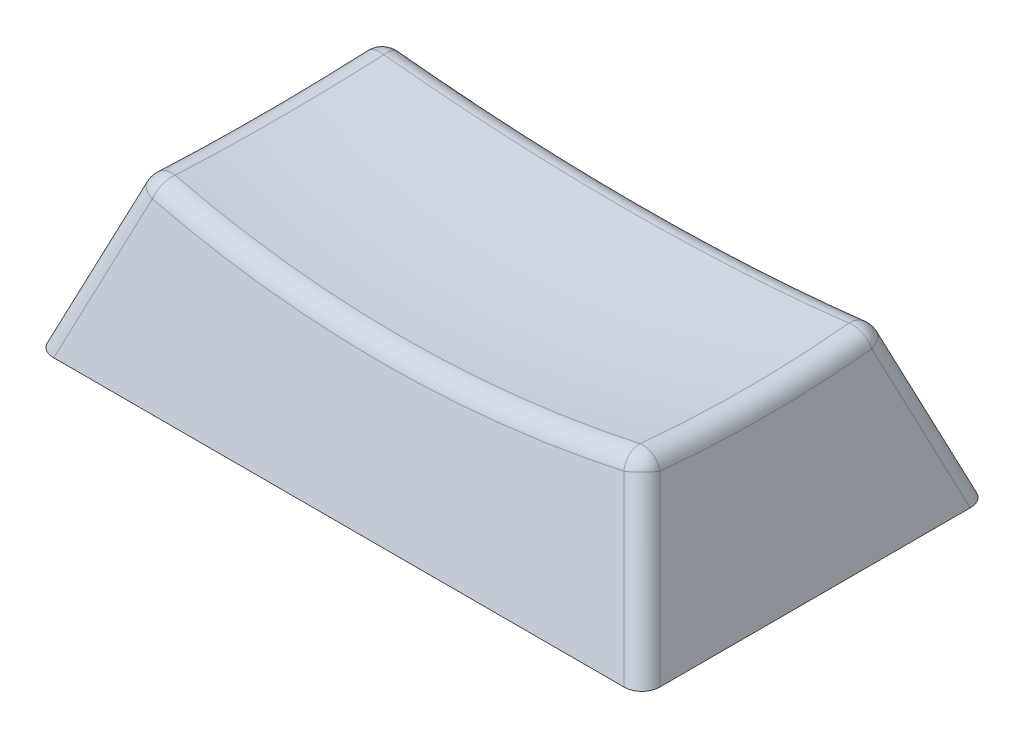
ISO-10303-21;
HEADER;
FILE_DESCRIPTION(('STEP AP214'),'2;1');
FILE_NAME('part.step','',(''),(''),'','','');
FILE_SCHEMA(('AUTOMOTIVE_DESIGN { 1 0 10303 214 1 1 1 1 }'));
ENDSEC;
DATA;
#1=APPLICATION_CONTEXT('core data for automotive mechanical design processes');
#2=APPLICATION_PROTOCOL_DEFINITION('international standard','automotive_design',2000,#1);
#3=PRODUCT_CONTEXT('',#1,'mechanical');
#4=PRODUCT('Part','Part','',(#3));
#5=PRODUCT_RELATED_PRODUCT_CATEGORY('part','',(#4));
#6=PRODUCT_DEFINITION_FORMATION('','',#4);
#7=PRODUCT_DEFINITION_CONTEXT('part definition',#1,'design');
#8=PRODUCT_DEFINITION('design','',#6,#7);
#9=PRODUCT_DEFINITION_SHAPE('','',#8);
#10=(LENGTH_UNIT() NAMED_UNIT(*) SI_UNIT(.MILLI.,.METRE.));
#11=(NAMED_UNIT(*) PLANE_ANGLE_UNIT() SI_UNIT($,.RADIAN.));
#12=(NAMED_UNIT(*) SI_UNIT($,.STERADIAN.) SOLID_ANGLE_UNIT());
#13=UNCERTAINTY_MEASURE_WITH_UNIT(LENGTH_MEASURE(1.E-05),#10,'distance_accuracy_value','');
#14=(GEOMETRIC_REPRESENTATION_CONTEXT(3) GLOBAL_UNCERTAINTY_ASSIGNED_CONTEXT((#13)) GLOBAL_UNIT_ASSIGNED_CONTEXT((#10,
#11,#12)) REPRESENTATION_CONTEXT('',''));
#15=CARTESIAN_POINT('',(0.,0.,0.));
#16=DIRECTION('',(0.,0.,1.));
#17=DIRECTION('',(1.,0.,0.));
#18=AXIS2_PLACEMENT_3D('',#15,#16,#17);
#19=CARTESIAN_POINT('',(-15.75,0.,9.00000000000001));
#20=DIRECTION('',(-0.941470544812038,0.337095258423083,0.));
#21=DIRECTION('',(-0.337095258423083,-0.941470544812038,0.));
#22=AXIS2_PLACEMENT_3D('',#19,#20,#21);
#23=PLANE('',#22);
#24=DIRECTION('',(0.,0.,1.));
#25=VECTOR('',#24,1.);
#26=CARTESIAN_POINT('',(-15.75,0.,9.00000000000001));
#27=LINE('',#26,#25);
#28=CARTESIAN_POINT('',(-15.75,0.,-8.05852945518796));
#29=VERTEX_POINT('',#28);
#30=CARTESIAN_POINT('',(-15.75,0.,8.05852945518797));
#31=VERTEX_POINT('',#30);
#32=EDGE_CURVE('E332',#29,#31,#27,.T.);
#33=ORIENTED_EDGE('',*,*,#32,.T.);
#34=DIRECTION('',(0.319434306340419,0.892145418564502,-0.31943430634042));
#35=VECTOR('',#34,1.);
#36=CARTESIAN_POINT('',(-15.8460660313606,-0.268302020343255,8.15459548654862));
#37=LINE('',#36,#35);
#38=CARTESIAN_POINT('',(-13.1906688464524,7.1479347017712,5.49919830164037));
#39=VERTEX_POINT('',#38);
#40=EDGE_CURVE('E364',#31,#39,#37,.T.);
#41=ORIENTED_EDGE('',*,*,#40,.T.);
#42=CARTESIAN_POINT('',(10.32758288797,72.8318644521076,0.));
#43=DIRECTION('',(-0.941470544812038,0.337095258423083,0.));
#44=DIRECTION('',(-0.337095258423083,-0.941470544812038,0.));
#45=AXIS2_PLACEMENT_3D('',#42,#43,#44);
#46=CIRCLE('',#45,69.9837693615567);
#47=CARTESIAN_POINT('',(-13.1906688464524,7.14793470177119,-5.49919830164036));
#48=VERTEX_POINT('',#47);
#49=EDGE_CURVE('E360',#39,#48,#46,.F.);
#50=ORIENTED_EDGE('',*,*,#49,.T.);
#51=DIRECTION('',(0.319434306340419,0.892145418564502,0.319434306340419));
#52=VECTOR('',#51,1.);
#53=CARTESIAN_POINT('',(-14.0093770621513,4.86137133246757,-6.31790651733928));
#54=LINE('',#53,#52);
#55=EDGE_CURVE('E362',#48,#29,#54,.F.);
#56=ORIENTED_EDGE('',*,*,#55,.T.);
#57=EDGE_LOOP('',(#33,#41,#50,#56));
#58=FACE_BOUND('',#57,.T.);
#59=ADVANCED_FACE('F35',(#58),#23,.T.);
#60=CARTESIAN_POINT('',(15.75,0.,9.));
#61=DIRECTION('',(0.,0.337095258423083,0.941470544812038));
#62=DIRECTION('',(0.,-0.941470544812038,0.337095258423083));
#63=AXIS2_PLACEMENT_3D('',#60,#61,#62);
#64=PLANE('',#63);
#65=CARTESIAN_POINT('',(0.,70.68964897005,-16.3105586985235));
#66=DIRECTION('',(0.,0.337095258423083,0.941470544812038));
#67=DIRECTION('',(0.,-0.941470544812038,0.337095258423083));
#68=AXIS2_PLACEMENT_3D('',#65,#66,#67);
#69=CIRCLE('',#68,68.5945381644032);
#70=CARTESIAN_POINT('',(12.2491983016404,7.14793470177119,6.4406688464524));
#71=VERTEX_POINT('',#70);
#72=CARTESIAN_POINT('',(-12.2491983016404,7.14793470177119,6.4406688464524));
#73=VERTEX_POINT('',#72);
#74=EDGE_CURVE('E347',#71,#73,#69,.F.);
#75=ORIENTED_EDGE('',*,*,#74,.T.);
#76=DIRECTION('',(0.31943430634042,0.892145418564502,-0.31943430634042));
#77=VECTOR('',#76,1.);
#78=CARTESIAN_POINT('',(-11.6903897904323,8.7086263470757,5.88186033524433));
#79=LINE('',#78,#77);
#80=CARTESIAN_POINT('',(-14.808529455188,0.,9.00000000000001));
#81=VERTEX_POINT('',#80);
#82=EDGE_CURVE('E349',#73,#81,#79,.F.);
#83=ORIENTED_EDGE('',*,*,#82,.T.);
#84=DIRECTION('',(1.,0.,0.));
#85=VECTOR('',#84,1.);
#86=CARTESIAN_POINT('',(15.75,0.,9.));
#87=LINE('',#86,#85);
#88=CARTESIAN_POINT('',(14.808529455188,0.,9.));
#89=VERTEX_POINT('',#88);
#90=EDGE_CURVE('E335',#81,#89,#87,.T.);
#91=ORIENTED_EDGE('',*,*,#90,.T.);
#92=DIRECTION('',(-0.319434306340419,0.892145418564502,-0.319434306340419));
#93=VECTOR('',#92,1.);
#94=CARTESIAN_POINT('',(14.9045954865486,-0.268302020343256,9.09606603136065));
#95=LINE('',#94,#93);
#96=EDGE_CURVE('E345',#89,#71,#95,.T.);
#97=ORIENTED_EDGE('',*,*,#96,.T.);
#98=EDGE_LOOP('',(#75,#83,#91,#97));
#99=FACE_BOUND('',#98,.T.);
#100=ADVANCED_FACE('F455',(#99),#64,.T.);
#101=CARTESIAN_POINT('',(15.75,0.,9.));
#102=DIRECTION('',(0.941470544812038,0.337095258423083,0.));
#103=DIRECTION('',(-0.337095258423083,0.941470544812038,0.));
#104=AXIS2_PLACEMENT_3D('',#101,#102,#103);
#105=PLANE('',#104);
#106=CARTESIAN_POINT('',(-10.32758288797,72.8318644521076,0.));
#107=DIRECTION('',(0.941470544812038,0.337095258423083,0.));
#108=DIRECTION('',(-0.337095258423083,0.941470544812038,0.));
#109=AXIS2_PLACEMENT_3D('',#106,#107,#108);
#110=CIRCLE('',#109,69.9837693615567);
#111=CARTESIAN_POINT('',(13.1906688464524,7.14793470177119,-5.49919830164036));
#112=VERTEX_POINT('',#111);
#113=CARTESIAN_POINT('',(13.1906688464524,7.14793470177119,5.49919830164036));
#114=VERTEX_POINT('',#113);
#115=EDGE_CURVE('E383',#112,#114,#110,.F.);
#116=ORIENTED_EDGE('',*,*,#115,.T.);
#117=DIRECTION('',(-0.319434306340419,0.892145418564502,-0.319434306340419));
#118=VECTOR('',#117,1.);
#119=CARTESIAN_POINT('',(15.8460660313607,-0.268302020343255,8.15459548654862));
#120=LINE('',#119,#118);
#121=CARTESIAN_POINT('',(15.75,0.,8.05852945518796));
#122=VERTEX_POINT('',#121);
#123=EDGE_CURVE('E43',#114,#122,#120,.F.);
#124=ORIENTED_EDGE('',*,*,#123,.T.);
#125=DIRECTION('',(0.,0.,-1.));
#126=VECTOR('',#125,1.);
#127=CARTESIAN_POINT('',(15.75,0.,9.));
#128=LINE('',#127,#126);
#129=CARTESIAN_POINT('',(15.75,0.,-8.05852945518796));
#130=VERTEX_POINT('',#129);
#131=EDGE_CURVE('E339',#122,#130,#128,.T.);
#132=ORIENTED_EDGE('',*,*,#131,.T.);
#133=DIRECTION('',(-0.31943430634042,0.892145418564502,0.31943430634042));
#134=VECTOR('',#133,1.);
#135=CARTESIAN_POINT('',(14.0093770621513,4.86137133246757,-6.31790651733929));
#136=LINE('',#135,#134);
#137=EDGE_CURVE('E381',#130,#112,#136,.T.);
#138=ORIENTED_EDGE('',*,*,#137,.T.);
#139=EDGE_LOOP('',(#116,#124,#132,#138));
#140=FACE_BOUND('',#139,.T.);
#141=ADVANCED_FACE('F443',(#140),#105,.T.);
#142=CARTESIAN_POINT('',(15.75,0.,-9.));
#143=DIRECTION('',(0.,0.337095258423083,-0.941470544812038));
#144=DIRECTION('',(0.,0.941470544812038,0.337095258423083));
#145=AXIS2_PLACEMENT_3D('',#142,#143,#144);
#146=PLANE('',#145);
#147=DIRECTION('',(-1.,0.,0.));
#148=VECTOR('',#147,1.);
#149=CARTESIAN_POINT('',(15.75,0.,-9.));
#150=LINE('',#149,#148);
#151=CARTESIAN_POINT('',(14.808529455188,0.,-9.));
#152=VERTEX_POINT('',#151);
#153=CARTESIAN_POINT('',(-14.808529455188,0.,-8.99999999999999));
#154=VERTEX_POINT('',#153);
#155=EDGE_CURVE('E342',#152,#154,#150,.T.);
#156=ORIENTED_EDGE('',*,*,#155,.T.);
#157=DIRECTION('',(0.319434306340419,0.892145418564502,0.319434306340419));
#158=VECTOR('',#157,1.);
#159=CARTESIAN_POINT('',(-11.6903897904323,8.70862634707569,-5.88186033524432));
#160=LINE('',#159,#158);
#161=CARTESIAN_POINT('',(-12.2491983016404,7.14793470177119,-6.44066884645239));
#162=VERTEX_POINT('',#161);
#163=EDGE_CURVE('E370',#154,#162,#160,.T.);
#164=ORIENTED_EDGE('',*,*,#163,.T.);
#165=CARTESIAN_POINT('',(0.,70.68964897005,16.3105586985235));
#166=DIRECTION('',(0.,0.337095258423083,-0.941470544812038));
#167=DIRECTION('',(0.,0.941470544812038,0.337095258423083));
#168=AXIS2_PLACEMENT_3D('',#165,#166,#167);
#169=CIRCLE('',#168,68.5945381644032);
#170=CARTESIAN_POINT('',(12.2491983016404,7.14793470177119,-6.4406688464524));
#171=VERTEX_POINT('',#170);
#172=EDGE_CURVE('E368',#162,#171,#169,.F.);
#173=ORIENTED_EDGE('',*,*,#172,.T.);
#174=DIRECTION('',(-0.31943430634042,0.892145418564502,0.31943430634042));
#175=VECTOR('',#174,1.);
#176=CARTESIAN_POINT('',(14.9045954865486,-0.268302020343255,-9.09606603136065));
#177=LINE('',#176,#175);
#178=EDGE_CURVE('E366',#171,#152,#177,.F.);
#179=ORIENTED_EDGE('',*,*,#178,.T.);
#180=EDGE_LOOP('',(#156,#164,#173,#179));
#181=FACE_BOUND('',#180,.T.);
#182=ADVANCED_FACE('F498',(#181),#146,.T.);
#183=CARTESIAN_POINT('',(0.,0.,0.));
#184=DIRECTION('',(0.,1.,0.));
#185=DIRECTION('',(0.,0.,1.));
#186=AXIS2_PLACEMENT_3D('',#183,#184,#185);
#187=PLANE('',#186);
#188=DIRECTION('',(0.,0.,-1.));
#189=VECTOR('',#188,1.);
#190=CARTESIAN_POINT('',(-14.1567478177987,0.,9.00000000000001));
#191=LINE('',#190,#189);
#192=CARTESIAN_POINT('',(-14.1567478177987,0.,-7.40674781779872));
#193=VERTEX_POINT('',#192);
#194=CARTESIAN_POINT('',(-14.1567478177987,0.,7.40674781779873));
#195=VERTEX_POINT('',#194);
#196=EDGE_CURVE('E318',#193,#195,#191,.F.);
#197=ORIENTED_EDGE('',*,*,#196,.T.);
#198=DIRECTION('',(-1.,0.,0.));
#199=VECTOR('',#198,1.);
#200=CARTESIAN_POINT('',(15.75,0.,7.40674781779873));
#201=LINE('',#200,#199);
#202=CARTESIAN_POINT('',(14.1567478177987,0.,7.40674781779873));
#203=VERTEX_POINT('',#202);
#204=EDGE_CURVE('E326',#195,#203,#201,.F.);
#205=ORIENTED_EDGE('',*,*,#204,.T.);
#206=DIRECTION('',(0.,0.,1.));
#207=VECTOR('',#206,1.);
#208=CARTESIAN_POINT('',(14.1567478177987,0.,9.));
#209=LINE('',#208,#207);
#210=CARTESIAN_POINT('',(14.1567478177987,0.,-7.40674781779873));
#211=VERTEX_POINT('',#210);
#212=EDGE_CURVE('E328',#203,#211,#209,.F.);
#213=ORIENTED_EDGE('',*,*,#212,.T.);
#214=DIRECTION('',(1.,0.,0.));
#215=VECTOR('',#214,1.);
#216=CARTESIAN_POINT('',(15.75,0.,-7.40674781779873));
#217=LINE('',#216,#215);
#218=EDGE_CURVE('E214',#211,#193,#217,.F.);
#219=ORIENTED_EDGE('',*,*,#218,.T.);
#220=EDGE_LOOP('',(#197,#205,#213,#219));
#221=FACE_BOUND('',#220,.T.);
#222=ORIENTED_EDGE('',*,*,#90,.F.);
#223=CARTESIAN_POINT('',(-14.6878318785325,0.,7.93783187853249));
#224=DIRECTION('',(0.,1.,0.));
#225=DIRECTION('',(-0.707106781186547,0.,0.707106781186548));
#226=AXIS2_PLACEMENT_3D('',#223,#224,#225);
#227=ELLIPSE('',#226,1.12089349918878,1.);
#228=EDGE_CURVE('E358',#81,#31,#227,.F.);
#229=ORIENTED_EDGE('',*,*,#228,.T.);
#230=ORIENTED_EDGE('',*,*,#32,.F.);
#231=CARTESIAN_POINT('',(-14.6878318785325,0.,-7.93783187853248));
#232=DIRECTION('',(0.,1.,0.));
#233=DIRECTION('',(-0.707106781186548,0.,-0.707106781186547));
#234=AXIS2_PLACEMENT_3D('',#231,#232,#233);
#235=ELLIPSE('',#234,1.12089349918878,1.);
#236=EDGE_CURVE('E356',#29,#154,#235,.F.);
#237=ORIENTED_EDGE('',*,*,#236,.T.);
#238=ORIENTED_EDGE('',*,*,#155,.F.);
#239=CARTESIAN_POINT('',(14.6878318785325,0.,-7.93783187853249));
#240=DIRECTION('',(0.,1.,0.));
#241=DIRECTION('',(0.707106781186548,0.,-0.707106781186548));
#242=AXIS2_PLACEMENT_3D('',#239,#240,#241);
#243=ELLIPSE('',#242,1.12089349918878,1.);
#244=EDGE_CURVE('E352',#152,#130,#243,.F.);
#245=ORIENTED_EDGE('',*,*,#244,.T.);
#246=ORIENTED_EDGE('',*,*,#131,.F.);
#247=CARTESIAN_POINT('',(14.6878318785325,0.,7.93783187853249));
#248=DIRECTION('',(0.,1.,0.));
#249=DIRECTION('',(0.707106781186548,0.,0.707106781186548));
#250=AXIS2_PLACEMENT_3D('',#247,#248,#249);
#251=ELLIPSE('',#250,1.12089349918878,1.);
#252=EDGE_CURVE('E354',#122,#89,#251,.F.);
#253=ORIENTED_EDGE('',*,*,#252,.T.);
#254=EDGE_LOOP('',(#222,#229,#230,#237,#238,#245,#246,#253));
#255=FACE_BOUND('',#254,.T.);
#256=ADVANCED_FACE('F453',(#221,#255),#187,.F.);
#257=CARTESIAN_POINT('',(0.,76.5296744809929,0.));
#258=DIRECTION('',(0.902871607312571,0.,0.429910293792571));
#259=DIRECTION('',(0.,1.,0.));
#260=AXIS2_PLACEMENT_3D('',#257,#258,#259);
#261=SPHERICAL_SURFACE('',#260,70.);
#262=CARTESIAN_POINT('',(0.,70.4395554126039,17.0090429159647));
#263=DIRECTION('',(0.,0.337095258423083,-0.941470544812038));
#264=DIRECTION('',(0.,0.941470544812038,0.337095258423083));
#265=AXIS2_PLACEMENT_3D('',#262,#263,#264);
#266=CIRCLE('',#265,67.6284179085665);
#267=CARTESIAN_POINT('',(12.076674381899,7.79279486641351,-5.42174480443416));
#268=VERTEX_POINT('',#267);
#269=CARTESIAN_POINT('',(-12.0766743818989,7.79279486641353,-5.42174480443415));
#270=VERTEX_POINT('',#269);
#271=EDGE_CURVE('E372',#268,#270,#266,.T.);
#272=ORIENTED_EDGE('',*,*,#271,.T.);
#273=CARTESIAN_POINT('',(11.1103343703485,72.5515988456185,0.));
#274=DIRECTION('',(-0.941470544812038,0.337095258423083,0.));
#275=DIRECTION('',(-0.337095258423083,-0.941470544812038,0.));
#276=AXIS2_PLACEMENT_3D('',#273,#274,#275);
#277=CIRCLE('',#276,68.9980824691404);
#278=CARTESIAN_POINT('',(-12.0766743818989,7.79279486641351,5.42174480443416));
#279=VERTEX_POINT('',#278);
#280=EDGE_CURVE('E378',#270,#279,#277,.T.);
#281=ORIENTED_EDGE('',*,*,#280,.T.);
#282=CARTESIAN_POINT('',(0.,70.4395554126039,-17.0090429159646));
#283=DIRECTION('',(0.,0.337095258423083,0.941470544812038));
#284=DIRECTION('',(0.,-0.941470544812038,0.337095258423083));
#285=AXIS2_PLACEMENT_3D('',#282,#283,#284);
#286=CIRCLE('',#285,67.6284179085665);
#287=CARTESIAN_POINT('',(12.076674381899,7.79279486641352,5.42174480443416));
#288=VERTEX_POINT('',#287);
#289=EDGE_CURVE('E376',#279,#288,#286,.T.);
#290=ORIENTED_EDGE('',*,*,#289,.T.);
#291=CARTESIAN_POINT('',(-11.1103343703485,72.5515988456185,0.));
#292=DIRECTION('',(0.941470544812038,0.337095258423083,0.));
#293=DIRECTION('',(-0.337095258423083,0.941470544812038,0.));
#294=AXIS2_PLACEMENT_3D('',#291,#292,#293);
#295=CIRCLE('',#294,68.9980824691404);
#296=EDGE_CURVE('E374',#288,#268,#295,.T.);
#297=ORIENTED_EDGE('',*,*,#296,.T.);
#298=EDGE_LOOP('',(#272,#281,#290,#297));
#299=FACE_BOUND('',#298,.T.);
#300=ADVANCED_FACE('F434',(#299),#261,.F.);
#301=CARTESIAN_POINT('',(14.9045954865486,-0.605397278766338,-8.15459548654862));
#302=DIRECTION('',(0.319434306340419,-0.892145418564502,-0.319434306340419));
#303=DIRECTION('',(0.,0.337095258423083,-0.941470544812038));
#304=AXIS2_PLACEMENT_3D('',#301,#302,#303);
#305=CYLINDRICAL_SURFACE('',#304,1.);
#306=CARTESIAN_POINT('',(12.2491983016404,6.8108394433481,-5.49919830164036));
#307=DIRECTION('',(-0.31943430634042,0.892145418564502,0.319434306340418));
#308=DIRECTION('',(-0.941470544812037,-0.337095258423083,0.));
#309=AXIS2_PLACEMENT_3D('',#306,#307,#308);
#310=CIRCLE('',#309,1.);
#311=EDGE_CURVE('E336',#112,#171,#310,.T.);
#312=ORIENTED_EDGE('',*,*,#311,.F.);
#313=ORIENTED_EDGE('',*,*,#137,.F.);
#314=ORIENTED_EDGE('',*,*,#244,.F.);
#315=ORIENTED_EDGE('',*,*,#178,.F.);
#316=EDGE_LOOP('',(#312,#313,#314,#315));
#317=FACE_BOUND('',#316,.T.);
#318=ADVANCED_FACE('F37',(#317),#305,.T.);
#319=CARTESIAN_POINT('',(12.2491983016404,6.81083944334812,-5.49919830164036));
#320=DIRECTION('',(0.,0.,1.));
#321=DIRECTION('',(1.,0.,0.));
#322=AXIS2_PLACEMENT_3D('',#319,#320,#321);
#323=SPHERICAL_SURFACE('',#322,1.);
#324=CARTESIAN_POINT('',(12.2491983016404,6.81083944334811,-5.49919830164035));
#325=DIRECTION('',(-0.0264883370747692,0.0739790564055941,-0.99690795322956));
#326=DIRECTION('',(0.,0.997257868635227,0.0740050231073835));
#327=AXIS2_PLACEMENT_3D('',#324,#325,#326);
#328=CIRCLE('',#327,1.);
#329=EDGE_CURVE('E411',#112,#268,#328,.F.);
#330=ORIENTED_EDGE('',*,*,#329,.F.);
#331=ORIENTED_EDGE('',*,*,#311,.T.);
#332=CARTESIAN_POINT('',(12.2491983016404,6.8108394433481,-5.49919830164036));
#333=DIRECTION('',(0.983926491602036,0.168122123235476,0.0601964351311862));
#334=DIRECTION('',(-0.168427558140453,0.985714034423191,0.));
#335=AXIS2_PLACEMENT_3D('',#332,#333,#334);
#336=CIRCLE('',#335,1.);
#337=EDGE_CURVE('E414',#268,#171,#336,.F.);
#338=ORIENTED_EDGE('',*,*,#337,.F.);
#339=EDGE_LOOP('',(#330,#331,#338));
#340=FACE_BOUND('',#339,.T.);
#341=ADVANCED_FACE('F421',(#340),#323,.T.);
#342=CARTESIAN_POINT('',(-13.0679065173393,4.52427607404449,-6.31790651733928));
#343=DIRECTION('',(-0.31943430634042,-0.892145418564502,-0.319434306340419));
#344=DIRECTION('',(0.941470544812038,-0.337095258423083,0.));
#345=AXIS2_PLACEMENT_3D('',#342,#343,#344);
#346=CYLINDRICAL_SURFACE('',#345,1.);
#347=ORIENTED_EDGE('',*,*,#236,.F.);
#348=ORIENTED_EDGE('',*,*,#55,.F.);
#349=CARTESIAN_POINT('',(-12.2491983016404,6.8108394433481,-5.49919830164036));
#350=DIRECTION('',(0.319434306340431,0.892145418564498,0.319434306340418));
#351=DIRECTION('',(-0.941470544812033,0.337095258423095,0.));
#352=AXIS2_PLACEMENT_3D('',#349,#350,#351);
#353=CIRCLE('',#352,1.);
#354=EDGE_CURVE('E408',#162,#48,#353,.T.);
#355=ORIENTED_EDGE('',*,*,#354,.F.);
#356=ORIENTED_EDGE('',*,*,#163,.F.);
#357=EDGE_LOOP('',(#347,#348,#355,#356));
#358=FACE_BOUND('',#357,.T.);
#359=ADVANCED_FACE('F469',(#358),#346,.T.);
#360=CARTESIAN_POINT('',(0.,70.3525537116269,17.2520292433356));
#361=DIRECTION('',(0.,0.337095258423083,-0.941470544812038));
#362=DIRECTION('',(0.,0.941470544812038,0.337095258423083));
#363=AXIS2_PLACEMENT_3D('',#360,#361,#362);
#364=TOROIDAL_SURFACE('',#363,68.5945381644032,1.);
#365=ORIENTED_EDGE('',*,*,#337,.T.);
#366=ORIENTED_EDGE('',*,*,#172,.F.);
#367=CARTESIAN_POINT('',(-12.2491983016404,6.81083944334811,-5.49919830164035));
#368=DIRECTION('',(-0.983926491602037,0.168122123235472,0.0601964351311815));
#369=DIRECTION('',(-0.168427558140449,-0.985714034423192,0.));
#370=AXIS2_PLACEMENT_3D('',#367,#368,#369);
#371=CIRCLE('',#370,1.);
#372=EDGE_CURVE('E405',#270,#162,#371,.T.);
#373=ORIENTED_EDGE('',*,*,#372,.F.);
#374=ORIENTED_EDGE('',*,*,#271,.F.);
#375=EDGE_LOOP('',(#365,#366,#373,#374));
#376=FACE_BOUND('',#375,.T.);
#377=ADVANCED_FACE('F429',(#376),#364,.T.);
#378=CARTESIAN_POINT('',(-11.269053432782,72.4947691936845,0.));
#379=DIRECTION('',(0.941470544812038,0.337095258423083,0.));
#380=DIRECTION('',(-0.337095258423083,0.941470544812038,0.));
#381=AXIS2_PLACEMENT_3D('',#378,#379,#380);
#382=TOROIDAL_SURFACE('',#381,69.9837693615567,1.);
#383=ORIENTED_EDGE('',*,*,#329,.T.);
#384=ORIENTED_EDGE('',*,*,#296,.F.);
#385=CARTESIAN_POINT('',(12.2491983016404,6.81083944334811,5.49919830164036));
#386=DIRECTION('',(-0.0264883370747615,0.0739790564055971,0.99690795322956));
#387=DIRECTION('',(0.,-0.997257868635227,0.0740050231073865));
#388=AXIS2_PLACEMENT_3D('',#385,#386,#387);
#389=CIRCLE('',#388,1.);
#390=EDGE_CURVE('E402',#114,#288,#389,.T.);
#391=ORIENTED_EDGE('',*,*,#390,.F.);
#392=ORIENTED_EDGE('',*,*,#115,.F.);
#393=EDGE_LOOP('',(#383,#384,#391,#392));
#394=FACE_BOUND('',#393,.T.);
#395=ADVANCED_FACE('F440',(#394),#382,.T.);
#396=CARTESIAN_POINT('',(14.9045954865486,-0.605397278766338,8.15459548654862));
#397=DIRECTION('',(0.319434306340419,-0.892145418564502,0.319434306340419));
#398=DIRECTION('',(0.,-0.337095258423083,-0.941470544812038));
#399=AXIS2_PLACEMENT_3D('',#396,#397,#398);
#400=CYLINDRICAL_SURFACE('',#399,1.);
#401=ORIENTED_EDGE('',*,*,#252,.F.);
#402=ORIENTED_EDGE('',*,*,#123,.F.);
#403=CARTESIAN_POINT('',(12.2491983016404,6.81083944334811,5.49919830164036));
#404=DIRECTION('',(-0.319434306340421,0.892145418564501,-0.31943430634042));
#405=DIRECTION('',(-0.941470544812037,-0.337095258423084,0.));
#406=AXIS2_PLACEMENT_3D('',#403,#404,#405);
#407=CIRCLE('',#406,1.);
#408=EDGE_CURVE('E399',#71,#114,#407,.T.);
#409=ORIENTED_EDGE('',*,*,#408,.F.);
#410=ORIENTED_EDGE('',*,*,#96,.F.);
#411=EDGE_LOOP('',(#401,#402,#409,#410));
#412=FACE_BOUND('',#411,.T.);
#413=ADVANCED_FACE('F448',(#412),#400,.T.);
#414=CARTESIAN_POINT('',(-12.2491983016404,6.81083944334812,-5.49919830164035));
#415=DIRECTION('',(0.,0.,1.));
#416=DIRECTION('',(1.,0.,0.));
#417=AXIS2_PLACEMENT_3D('',#414,#415,#416);
#418=SPHERICAL_SURFACE('',#417,1.);
#419=ORIENTED_EDGE('',*,*,#372,.T.);
#420=ORIENTED_EDGE('',*,*,#354,.T.);
#421=CARTESIAN_POINT('',(-12.2491983016404,6.8108394433481,-5.49919830164036));
#422=DIRECTION('',(0.0264883370747646,0.0739790564056059,-0.996907953229559));
#423=DIRECTION('',(0.,0.997257868635226,0.0740050231073953));
#424=AXIS2_PLACEMENT_3D('',#421,#422,#423);
#425=CIRCLE('',#424,1.);
#426=EDGE_CURVE('E396',#270,#48,#425,.F.);
#427=ORIENTED_EDGE('',*,*,#426,.F.);
#428=EDGE_LOOP('',(#419,#420,#427));
#429=FACE_BOUND('',#428,.T.);
#430=ADVANCED_FACE('F472',(#429),#418,.T.);
#431=CARTESIAN_POINT('',(12.2491983016404,6.81083944334812,5.49919830164036));
#432=DIRECTION('',(0.,0.,1.));
#433=DIRECTION('',(1.,0.,0.));
#434=AXIS2_PLACEMENT_3D('',#431,#432,#433);
#435=SPHERICAL_SURFACE('',#434,1.);
#436=ORIENTED_EDGE('',*,*,#408,.T.);
#437=ORIENTED_EDGE('',*,*,#390,.T.);
#438=CARTESIAN_POINT('',(12.2491983016404,6.8108394433481,5.49919830164036));
#439=DIRECTION('',(0.983926491602037,0.168122123235472,-0.0601964351311862));
#440=DIRECTION('',(-0.168427558140449,0.985714034423192,0.));
#441=AXIS2_PLACEMENT_3D('',#438,#439,#440);
#442=CIRCLE('',#441,1.);
#443=EDGE_CURVE('E393',#71,#288,#442,.F.);
#444=ORIENTED_EDGE('',*,*,#443,.F.);
#445=EDGE_LOOP('',(#436,#437,#444));
#446=FACE_BOUND('',#445,.T.);
#447=ADVANCED_FACE('F480',(#446),#435,.T.);
#448=CARTESIAN_POINT('',(11.269053432782,72.4947691936845,0.));
#449=DIRECTION('',(-0.941470544812038,0.337095258423083,0.));
#450=DIRECTION('',(-0.337095258423083,-0.941470544812038,0.));
#451=AXIS2_PLACEMENT_3D('',#448,#449,#450);
#452=TOROIDAL_SURFACE('',#451,69.9837693615567,1.);
#453=ORIENTED_EDGE('',*,*,#426,.T.);
#454=ORIENTED_EDGE('',*,*,#49,.F.);
#455=CARTESIAN_POINT('',(-12.2491983016404,6.81083944334811,5.49919830164036));
#456=DIRECTION('',(0.0264883370747638,0.0739790564055949,0.99690795322956));
#457=DIRECTION('',(0.,-0.997257868635227,0.0740050231073843));
#458=AXIS2_PLACEMENT_3D('',#455,#456,#457);
#459=CIRCLE('',#458,1.);
#460=EDGE_CURVE('E390',#279,#39,#459,.T.);
#461=ORIENTED_EDGE('',*,*,#460,.F.);
#462=ORIENTED_EDGE('',*,*,#280,.F.);
#463=EDGE_LOOP('',(#453,#454,#461,#462));
#464=FACE_BOUND('',#463,.T.);
#465=ADVANCED_FACE('F474',(#464),#452,.T.);
#466=CARTESIAN_POINT('',(0.,70.3525537116269,-17.2520292433356));
#467=DIRECTION('',(0.,0.337095258423083,0.941470544812038));
#468=DIRECTION('',(0.,-0.941470544812038,0.337095258423083));
#469=AXIS2_PLACEMENT_3D('',#466,#467,#468);
#470=TOROIDAL_SURFACE('',#469,68.5945381644032,1.);
#471=ORIENTED_EDGE('',*,*,#443,.T.);
#472=ORIENTED_EDGE('',*,*,#289,.F.);
#473=CARTESIAN_POINT('',(-12.2491983016404,6.8108394433481,5.49919830164037));
#474=DIRECTION('',(-0.983926491602036,0.168122123235476,-0.0601964351311863));
#475=DIRECTION('',(-0.168427558140454,-0.985714034423191,0.));
#476=AXIS2_PLACEMENT_3D('',#473,#474,#475);
#477=CIRCLE('',#476,1.);
#478=EDGE_CURVE('E388',#73,#279,#477,.T.);
#479=ORIENTED_EDGE('',*,*,#478,.F.);
#480=ORIENTED_EDGE('',*,*,#74,.F.);
#481=EDGE_LOOP('',(#471,#472,#479,#480));
#482=FACE_BOUND('',#481,.T.);
#483=ADVANCED_FACE('F478',(#482),#470,.T.);
#484=CARTESIAN_POINT('',(-12.2491983016404,6.81083944334812,5.49919830164036));
#485=DIRECTION('',(0.,0.,1.));
#486=DIRECTION('',(1.,0.,0.));
#487=AXIS2_PLACEMENT_3D('',#484,#485,#486);
#488=SPHERICAL_SURFACE('',#487,1.);
#489=ORIENTED_EDGE('',*,*,#478,.T.);
#490=ORIENTED_EDGE('',*,*,#460,.T.);
#491=CARTESIAN_POINT('',(-12.2491983016404,6.81083944334811,5.49919830164037));
#492=DIRECTION('',(0.319434306340421,0.892145418564504,-0.319434306340411));
#493=DIRECTION('',(-0.941470544812038,0.337095258423083,0.));
#494=AXIS2_PLACEMENT_3D('',#491,#492,#493);
#495=CIRCLE('',#494,1.);
#496=EDGE_CURVE('E322',#73,#39,#495,.F.);
#497=ORIENTED_EDGE('',*,*,#496,.F.);
#498=EDGE_LOOP('',(#489,#490,#497));
#499=FACE_BOUND('',#498,.T.);
#500=ADVANCED_FACE('F507',(#499),#488,.T.);
#501=CARTESIAN_POINT('',(-11.6903897904323,8.37153108865261,4.94038979043229));
#502=DIRECTION('',(-0.31943430634042,-0.892145418564502,0.31943430634042));
#503=DIRECTION('',(0.,-0.337095258423083,-0.941470544812038));
#504=AXIS2_PLACEMENT_3D('',#501,#502,#503);
#505=CYLINDRICAL_SURFACE('',#504,1.);
#506=ORIENTED_EDGE('',*,*,#496,.T.);
#507=ORIENTED_EDGE('',*,*,#40,.F.);
#508=ORIENTED_EDGE('',*,*,#228,.F.);
#509=ORIENTED_EDGE('',*,*,#82,.F.);
#510=EDGE_LOOP('',(#506,#507,#508,#509));
#511=FACE_BOUND('',#510,.T.);
#512=ADVANCED_FACE('F460',(#511),#505,.T.);
#513=CARTESIAN_POINT('',(-14.3377941827819,-0.505642887634624,9.00000000000001));
#514=DIRECTION('',(-0.941470544812038,0.337095258423083,0.));
#515=DIRECTION('',(-0.337095258423083,-0.941470544812038,0.));
#516=AXIS2_PLACEMENT_3D('',#513,#514,#515);
#517=PLANE('',#516);
#518=DIRECTION('',(0.,0.,-1.));
#519=VECTOR('',#518,1.);
#520=CARTESIAN_POINT('',(-12.4515259422057,4.7625,0.));
#521=LINE('',#520,#519);
#522=CARTESIAN_POINT('',(-12.4515259422057,4.7625,-5.70152594220574));
#523=VERTEX_POINT('',#522);
#524=CARTESIAN_POINT('',(-12.4515259422057,4.7625,5.70152594220575));
#525=VERTEX_POINT('',#524);
#526=EDGE_CURVE('E50',#523,#525,#521,.F.);
#527=ORIENTED_EDGE('',*,*,#526,.T.);
#528=DIRECTION('',(0.31943430634042,0.892145418564502,-0.31943430634042));
#529=VECTOR('',#528,1.);
#530=CARTESIAN_POINT('',(-14.4818932298229,-0.908095918149508,7.73189322982293));
#531=LINE('',#530,#529);
#532=EDGE_CURVE('E219',#195,#525,#531,.T.);
#533=ORIENTED_EDGE('',*,*,#532,.F.);
#534=ORIENTED_EDGE('',*,*,#196,.F.);
#535=DIRECTION('',(-0.31943430634042,-0.892145418564502,-0.319434306340419));
#536=VECTOR('',#535,1.);
#537=CARTESIAN_POINT('',(-12.6452042606136,4.22157743466132,-5.89520426061359));
#538=LINE('',#537,#536);
#539=EDGE_CURVE('E320',#523,#193,#538,.T.);
#540=ORIENTED_EDGE('',*,*,#539,.F.);
#541=EDGE_LOOP('',(#527,#533,#534,#540));
#542=FACE_BOUND('',#541,.T.);
#543=ADVANCED_FACE('F506',(#542),#517,.F.);
#544=CARTESIAN_POINT('',(15.75,-0.505642887634624,7.58779418278194));
#545=DIRECTION('',(0.,0.337095258423083,0.941470544812038));
#546=DIRECTION('',(0.,-0.941470544812038,0.337095258423083));
#547=AXIS2_PLACEMENT_3D('',#544,#545,#546);
#548=PLANE('',#547);
#549=DIRECTION('',(-1.,0.,0.));
#550=VECTOR('',#549,1.);
#551=CARTESIAN_POINT('',(0.,4.7625,5.70152594220575));
#552=LINE('',#551,#550);
#553=CARTESIAN_POINT('',(12.4515259422057,4.7625,5.70152594220574));
#554=VERTEX_POINT('',#553);
#555=EDGE_CURVE('E57',#525,#554,#552,.F.);
#556=ORIENTED_EDGE('',*,*,#555,.T.);
#557=DIRECTION('',(0.319434306340419,-0.892145418564502,0.319434306340419));
#558=VECTOR('',#557,1.);
#559=CARTESIAN_POINT('',(14.4818932298229,-0.908095918149507,7.73189322982292));
#560=LINE('',#559,#558);
#561=EDGE_CURVE('E218',#554,#203,#560,.T.);
#562=ORIENTED_EDGE('',*,*,#561,.T.);
#563=ORIENTED_EDGE('',*,*,#204,.F.);
#564=ORIENTED_EDGE('',*,*,#532,.T.);
#565=EDGE_LOOP('',(#556,#562,#563,#564));
#566=FACE_BOUND('',#565,.T.);
#567=ADVANCED_FACE('F530',(#566),#548,.F.);
#568=CARTESIAN_POINT('',(14.3377941827819,-0.505642887634624,9.));
#569=DIRECTION('',(0.941470544812038,0.337095258423083,0.));
#570=DIRECTION('',(-0.337095258423083,0.941470544812038,0.));
#571=AXIS2_PLACEMENT_3D('',#568,#569,#570);
#572=PLANE('',#571);
#573=DIRECTION('',(0.,0.,1.));
#574=VECTOR('',#573,1.);
#575=CARTESIAN_POINT('',(12.4515259422057,4.7625,0.));
#576=LINE('',#575,#574);
#577=CARTESIAN_POINT('',(12.4515259422057,4.7625,-5.70152594220574));
#578=VERTEX_POINT('',#577);
#579=EDGE_CURVE('E222',#554,#578,#576,.F.);
#580=ORIENTED_EDGE('',*,*,#579,.T.);
#581=DIRECTION('',(-0.319434306340419,0.892145418564502,0.319434306340419));
#582=VECTOR('',#581,1.);
#583=CARTESIAN_POINT('',(12.6452042606136,4.22157743466132,-5.8952042606136));
#584=LINE('',#583,#582);
#585=EDGE_CURVE('E208',#211,#578,#584,.T.);
#586=ORIENTED_EDGE('',*,*,#585,.F.);
#587=ORIENTED_EDGE('',*,*,#212,.F.);
#588=ORIENTED_EDGE('',*,*,#561,.F.);
#589=EDGE_LOOP('',(#580,#586,#587,#588));
#590=FACE_BOUND('',#589,.T.);
#591=ADVANCED_FACE('F223',(#590),#572,.F.);
#592=CARTESIAN_POINT('',(15.75,-0.505642887634624,-7.58779418278194));
#593=DIRECTION('',(0.,0.337095258423083,-0.941470544812038));
#594=DIRECTION('',(0.,0.941470544812038,0.337095258423083));
#595=AXIS2_PLACEMENT_3D('',#592,#593,#594);
#596=PLANE('',#595);
#597=DIRECTION('',(1.,0.,0.));
#598=VECTOR('',#597,1.);
#599=CARTESIAN_POINT('',(0.,4.7625,-5.70152594220574));
#600=LINE('',#599,#598);
#601=EDGE_CURVE('E212',#578,#523,#600,.F.);
#602=ORIENTED_EDGE('',*,*,#601,.T.);
#603=ORIENTED_EDGE('',*,*,#539,.T.);
#604=ORIENTED_EDGE('',*,*,#218,.F.);
#605=ORIENTED_EDGE('',*,*,#585,.T.);
#606=EDGE_LOOP('',(#602,#603,#604,#605));
#607=FACE_BOUND('',#606,.T.);
#608=ADVANCED_FACE('F210',(#607),#596,.F.);
#609=CARTESIAN_POINT('',(0.,4.7625,0.));
#610=DIRECTION('',(0.,-1.,0.));
#611=DIRECTION('',(0.,0.,-1.));
#612=AXIS2_PLACEMENT_3D('',#609,#610,#611);
#613=PLANE('',#612);
#614=CARTESIAN_POINT('',(0.,4.7625,0.));
#615=DIRECTION('',(0.,-1.,0.));
#616=DIRECTION('',(0.,0.,-1.));
#617=AXIS2_PLACEMENT_3D('',#614,#615,#616);
#618=CIRCLE('',#617,2.75);
#619=CARTESIAN_POINT('',(0.,4.7625,-2.75));
#620=VERTEX_POINT('',#619);
#621=EDGE_CURVE('E11',#620,#620,#618,.F.);
#622=ORIENTED_EDGE('',*,*,#621,.T.);
#623=EDGE_LOOP('',(#622));
#624=FACE_BOUND('',#623,.T.);
#625=ORIENTED_EDGE('',*,*,#579,.F.);
#626=ORIENTED_EDGE('',*,*,#555,.F.);
#627=ORIENTED_EDGE('',*,*,#526,.F.);
#628=ORIENTED_EDGE('',*,*,#601,.F.);
#629=EDGE_LOOP('',(#625,#626,#627,#628));
#630=FACE_BOUND('',#629,.T.);
#631=ADVANCED_FACE('F226',(#624,#630),#613,.T.);
#632=CARTESIAN_POINT('',(0.,4.7625,0.));
#633=DIRECTION('',(0.,-1.,0.));
#634=DIRECTION('',(0.,0.,-1.));
#635=AXIS2_PLACEMENT_3D('',#632,#633,#634);
#636=PLANE('',#635);
#637=DIRECTION('',(1.,0.,0.));
#638=VECTOR('',#637,1.);
#639=CARTESIAN_POINT('',(0.,4.7625,-2.05));
#640=LINE('',#639,#638);
#641=CARTESIAN_POINT('',(-0.55,4.7625,-2.05));
#642=VERTEX_POINT('',#641);
#643=CARTESIAN_POINT('',(0.550000000000001,4.7625,-2.05));
#644=VERTEX_POINT('',#643);
#645=EDGE_CURVE('E251',#642,#644,#640,.T.);
#646=ORIENTED_EDGE('',*,*,#645,.T.);
#647=DIRECTION('',(0.,0.,1.));
#648=VECTOR('',#647,1.);
#649=CARTESIAN_POINT('',(0.550000000000001,4.7625,0.));
#650=LINE('',#649,#648);
#651=CARTESIAN_POINT('',(0.550000000000001,4.7625,-0.55));
#652=VERTEX_POINT('',#651);
#653=EDGE_CURVE('E253',#644,#652,#650,.T.);
#654=ORIENTED_EDGE('',*,*,#653,.T.);
#655=DIRECTION('',(1.,0.,0.));
#656=VECTOR('',#655,1.);
#657=CARTESIAN_POINT('',(0.,4.7625,-0.55));
#658=LINE('',#657,#656);
#659=CARTESIAN_POINT('',(2.05,4.7625,-0.55));
#660=VERTEX_POINT('',#659);
#661=EDGE_CURVE('E233',#652,#660,#658,.T.);
#662=ORIENTED_EDGE('',*,*,#661,.T.);
#663=DIRECTION('',(0.,0.,1.));
#664=VECTOR('',#663,1.);
#665=CARTESIAN_POINT('',(2.05,4.7625,0.));
#666=LINE('',#665,#664);
#667=CARTESIAN_POINT('',(2.05,4.7625,0.55));
#668=VERTEX_POINT('',#667);
#669=EDGE_CURVE('E228',#660,#668,#666,.T.);
#670=ORIENTED_EDGE('',*,*,#669,.T.);
#671=DIRECTION('',(-1.,0.,0.));
#672=VECTOR('',#671,1.);
#673=CARTESIAN_POINT('',(0.,4.7625,0.55));
#674=LINE('',#673,#672);
#675=CARTESIAN_POINT('',(0.55,4.7625,0.55));
#676=VERTEX_POINT('',#675);
#677=EDGE_CURVE('E235',#668,#676,#674,.T.);
#678=ORIENTED_EDGE('',*,*,#677,.T.);
#679=DIRECTION('',(0.,0.,1.));
#680=VECTOR('',#679,1.);
#681=CARTESIAN_POINT('',(0.550000000000001,4.7625,0.));
#682=LINE('',#681,#680);
#683=CARTESIAN_POINT('',(0.55,4.7625,2.05));
#684=VERTEX_POINT('',#683);
#685=EDGE_CURVE('E237',#676,#684,#682,.T.);
#686=ORIENTED_EDGE('',*,*,#685,.T.);
#687=DIRECTION('',(-1.,0.,0.));
#688=VECTOR('',#687,1.);
#689=CARTESIAN_POINT('',(0.,4.7625,2.05));
#690=LINE('',#689,#688);
#691=CARTESIAN_POINT('',(-0.55,4.7625,2.05));
#692=VERTEX_POINT('',#691);
#693=EDGE_CURVE('E239',#684,#692,#690,.T.);
#694=ORIENTED_EDGE('',*,*,#693,.T.);
#695=DIRECTION('',(0.,0.,-1.));
#696=VECTOR('',#695,1.);
#697=CARTESIAN_POINT('',(-0.55,4.7625,0.));
#698=LINE('',#697,#696);
#699=CARTESIAN_POINT('',(-0.55,4.7625,0.55));
#700=VERTEX_POINT('',#699);
#701=EDGE_CURVE('E241',#692,#700,#698,.T.);
#702=ORIENTED_EDGE('',*,*,#701,.T.);
#703=DIRECTION('',(-1.,0.,0.));
#704=VECTOR('',#703,1.);
#705=CARTESIAN_POINT('',(0.,4.7625,0.55));
#706=LINE('',#705,#704);
#707=CARTESIAN_POINT('',(-2.05,4.7625,0.55));
#708=VERTEX_POINT('',#707);
#709=EDGE_CURVE('E243',#700,#708,#706,.T.);
#710=ORIENTED_EDGE('',*,*,#709,.T.);
#711=DIRECTION('',(0.,0.,-1.));
#712=VECTOR('',#711,1.);
#713=CARTESIAN_POINT('',(-2.05,4.7625,0.));
#714=LINE('',#713,#712);
#715=CARTESIAN_POINT('',(-2.05,4.7625,-0.550000000000001));
#716=VERTEX_POINT('',#715);
#717=EDGE_CURVE('E245',#708,#716,#714,.T.);
#718=ORIENTED_EDGE('',*,*,#717,.T.);
#719=DIRECTION('',(1.,0.,0.));
#720=VECTOR('',#719,1.);
#721=CARTESIAN_POINT('',(0.,4.7625,-0.55));
#722=LINE('',#721,#720);
#723=CARTESIAN_POINT('',(-0.55,4.7625,-0.55));
#724=VERTEX_POINT('',#723);
#725=EDGE_CURVE('E247',#716,#724,#722,.T.);
#726=ORIENTED_EDGE('',*,*,#725,.T.);
#727=DIRECTION('',(0.,0.,-1.));
#728=VECTOR('',#727,1.);
#729=CARTESIAN_POINT('',(-0.55,4.7625,0.));
#730=LINE('',#729,#728);
#731=EDGE_CURVE('E249',#724,#642,#730,.T.);
#732=ORIENTED_EDGE('',*,*,#731,.T.);
#733=EDGE_LOOP('',(#646,#654,#662,#670,#678,#686,#694,#702,#710,#718,#726,#732));
#734=FACE_BOUND('',#733,.T.);
#735=ADVANCED_FACE('F556',(#734),#636,.T.);
#736=CARTESIAN_POINT('',(0.55,7.81183944334812,0.55));
#737=DIRECTION('',(0.,0.,1.));
#738=DIRECTION('',(1.,0.,0.));
#739=AXIS2_PLACEMENT_3D('',#736,#737,#738);
#740=PLANE('',#739);
#741=DIRECTION('',(0.,-1.,0.));
#742=VECTOR('',#741,1.);
#743=CARTESIAN_POINT('',(0.55,7.81183944334812,0.55));
#744=LINE('',#743,#742);
#745=CARTESIAN_POINT('',(0.55,0.,0.55));
#746=VERTEX_POINT('',#745);
#747=EDGE_CURVE('E313',#676,#746,#744,.T.);
#748=ORIENTED_EDGE('',*,*,#747,.F.);
#749=ORIENTED_EDGE('',*,*,#677,.F.);
#750=DIRECTION('',(0.,-1.,0.));
#751=VECTOR('',#750,1.);
#752=CARTESIAN_POINT('',(2.05,7.81183944334812,0.55));
#753=LINE('',#752,#751);
#754=CARTESIAN_POINT('',(2.05,0.,0.55));
#755=VERTEX_POINT('',#754);
#756=EDGE_CURVE('E291',#668,#755,#753,.T.);
#757=ORIENTED_EDGE('',*,*,#756,.T.);
#758=DIRECTION('',(-1.,0.,0.));
#759=VECTOR('',#758,1.);
#760=CARTESIAN_POINT('',(0.55,0.,0.55));
#761=LINE('',#760,#759);
#762=EDGE_CURVE('E255',#755,#746,#761,.T.);
#763=ORIENTED_EDGE('',*,*,#762,.T.);
#764=EDGE_LOOP('',(#748,#749,#757,#763));
#765=FACE_BOUND('',#764,.T.);
#766=ADVANCED_FACE('F564',(#765),#740,.F.);
#767=CARTESIAN_POINT('',(0.55,7.81183944334812,2.05));
#768=DIRECTION('',(1.,0.,0.));
#769=DIRECTION('',(0.,0.,-1.));
#770=AXIS2_PLACEMENT_3D('',#767,#768,#769);
#771=PLANE('',#770);
#772=DIRECTION('',(0.,-1.,0.));
#773=VECTOR('',#772,1.);
#774=CARTESIAN_POINT('',(0.55,7.81183944334812,2.05));
#775=LINE('',#774,#773);
#776=CARTESIAN_POINT('',(0.55,0.,2.05));
#777=VERTEX_POINT('',#776);
#778=EDGE_CURVE('E311',#684,#777,#775,.T.);
#779=ORIENTED_EDGE('',*,*,#778,.F.);
#780=ORIENTED_EDGE('',*,*,#685,.F.);
#781=ORIENTED_EDGE('',*,*,#747,.T.);
#782=DIRECTION('',(0.,0.,1.));
#783=VECTOR('',#782,1.);
#784=CARTESIAN_POINT('',(0.55,0.,2.05));
#785=LINE('',#784,#783);
#786=EDGE_CURVE('E258',#746,#777,#785,.T.);
#787=ORIENTED_EDGE('',*,*,#786,.T.);
#788=EDGE_LOOP('',(#779,#780,#781,#787));
#789=FACE_BOUND('',#788,.T.);
#790=ADVANCED_FACE('F572',(#789),#771,.F.);
#791=CARTESIAN_POINT('',(-0.55,7.81183944334812,2.05));
#792=DIRECTION('',(0.,0.,1.));
#793=DIRECTION('',(1.,0.,0.));
#794=AXIS2_PLACEMENT_3D('',#791,#792,#793);
#795=PLANE('',#794);
#796=DIRECTION('',(0.,-1.,0.));
#797=VECTOR('',#796,1.);
#798=CARTESIAN_POINT('',(-0.55,7.81183944334812,2.05));
#799=LINE('',#798,#797);
#800=CARTESIAN_POINT('',(-0.55,0.,2.05));
#801=VERTEX_POINT('',#800);
#802=EDGE_CURVE('E309',#692,#801,#799,.T.);
#803=ORIENTED_EDGE('',*,*,#802,.F.);
#804=ORIENTED_EDGE('',*,*,#693,.F.);
#805=ORIENTED_EDGE('',*,*,#778,.T.);
#806=DIRECTION('',(-1.,0.,0.));
#807=VECTOR('',#806,1.);
#808=CARTESIAN_POINT('',(-0.55,0.,2.05));
#809=LINE('',#808,#807);
#810=EDGE_CURVE('E261',#777,#801,#809,.T.);
#811=ORIENTED_EDGE('',*,*,#810,.T.);
#812=EDGE_LOOP('',(#803,#804,#805,#811));
#813=FACE_BOUND('',#812,.T.);
#814=ADVANCED_FACE('F580',(#813),#795,.F.);
#815=CARTESIAN_POINT('',(-0.55,7.81183944334812,0.55));
#816=DIRECTION('',(-1.,0.,0.));
#817=DIRECTION('',(0.,0.,1.));
#818=AXIS2_PLACEMENT_3D('',#815,#816,#817);
#819=PLANE('',#818);
#820=DIRECTION('',(0.,-1.,0.));
#821=VECTOR('',#820,1.);
#822=CARTESIAN_POINT('',(-0.55,7.81183944334812,0.55));
#823=LINE('',#822,#821);
#824=CARTESIAN_POINT('',(-0.55,0.,0.55));
#825=VERTEX_POINT('',#824);
#826=EDGE_CURVE('E307',#700,#825,#823,.T.);
#827=ORIENTED_EDGE('',*,*,#826,.F.);
#828=ORIENTED_EDGE('',*,*,#701,.F.);
#829=ORIENTED_EDGE('',*,*,#802,.T.);
#830=DIRECTION('',(0.,0.,-1.));
#831=VECTOR('',#830,1.);
#832=CARTESIAN_POINT('',(-0.55,0.,0.55));
#833=LINE('',#832,#831);
#834=EDGE_CURVE('E264',#801,#825,#833,.T.);
#835=ORIENTED_EDGE('',*,*,#834,.T.);
#836=EDGE_LOOP('',(#827,#828,#829,#835));
#837=FACE_BOUND('',#836,.T.);
#838=ADVANCED_FACE('F588',(#837),#819,.F.);
#839=CARTESIAN_POINT('',(-2.05,7.81183944334812,0.55));
#840=DIRECTION('',(0.,0.,1.));
#841=DIRECTION('',(1.,0.,0.));
#842=AXIS2_PLACEMENT_3D('',#839,#840,#841);
#843=PLANE('',#842);
#844=DIRECTION('',(0.,-1.,0.));
#845=VECTOR('',#844,1.);
#846=CARTESIAN_POINT('',(-2.05,7.81183944334812,0.55));
#847=LINE('',#846,#845);
#848=CARTESIAN_POINT('',(-2.05,0.,0.55));
#849=VERTEX_POINT('',#848);
#850=EDGE_CURVE('E305',#708,#849,#847,.T.);
#851=ORIENTED_EDGE('',*,*,#850,.F.);
#852=ORIENTED_EDGE('',*,*,#709,.F.);
#853=ORIENTED_EDGE('',*,*,#826,.T.);
#854=DIRECTION('',(-1.,0.,0.));
#855=VECTOR('',#854,1.);
#856=CARTESIAN_POINT('',(-2.05,0.,0.55));
#857=LINE('',#856,#855);
#858=EDGE_CURVE('E267',#825,#849,#857,.T.);
#859=ORIENTED_EDGE('',*,*,#858,.T.);
#860=EDGE_LOOP('',(#851,#852,#853,#859));
#861=FACE_BOUND('',#860,.T.);
#862=ADVANCED_FACE('F596',(#861),#843,.F.);
#863=CARTESIAN_POINT('',(-2.05,7.81183944334812,-0.550000000000001));
#864=DIRECTION('',(-1.,0.,0.));
#865=DIRECTION('',(0.,0.,1.));
#866=AXIS2_PLACEMENT_3D('',#863,#864,#865);
#867=PLANE('',#866);
#868=DIRECTION('',(0.,-1.,0.));
#869=VECTOR('',#868,1.);
#870=CARTESIAN_POINT('',(-2.05,7.81183944334812,-0.550000000000001));
#871=LINE('',#870,#869);
#872=CARTESIAN_POINT('',(-2.05,0.,-0.550000000000001));
#873=VERTEX_POINT('',#872);
#874=EDGE_CURVE('E303',#716,#873,#871,.T.);
#875=ORIENTED_EDGE('',*,*,#874,.F.);
#876=ORIENTED_EDGE('',*,*,#717,.F.);
#877=ORIENTED_EDGE('',*,*,#850,.T.);
#878=DIRECTION('',(0.,0.,-1.));
#879=VECTOR('',#878,1.);
#880=CARTESIAN_POINT('',(-2.05,0.,-0.550000000000001));
#881=LINE('',#880,#879);
#882=EDGE_CURVE('E270',#849,#873,#881,.T.);
#883=ORIENTED_EDGE('',*,*,#882,.T.);
#884=EDGE_LOOP('',(#875,#876,#877,#883));
#885=FACE_BOUND('',#884,.T.);
#886=ADVANCED_FACE('F604',(#885),#867,.F.);
#887=CARTESIAN_POINT('',(-0.55,7.81183944334812,-0.55));
#888=DIRECTION('',(0.,0.,-1.));
#889=DIRECTION('',(-1.,0.,0.));
#890=AXIS2_PLACEMENT_3D('',#887,#888,#889);
#891=PLANE('',#890);
#892=DIRECTION('',(0.,-1.,0.));
#893=VECTOR('',#892,1.);
#894=CARTESIAN_POINT('',(-0.55,7.81183944334812,-0.55));
#895=LINE('',#894,#893);
#896=CARTESIAN_POINT('',(-0.55,0.,-0.55));
#897=VERTEX_POINT('',#896);
#898=EDGE_CURVE('E301',#724,#897,#895,.T.);
#899=ORIENTED_EDGE('',*,*,#898,.F.);
#900=ORIENTED_EDGE('',*,*,#725,.F.);
#901=ORIENTED_EDGE('',*,*,#874,.T.);
#902=DIRECTION('',(1.,0.,0.));
#903=VECTOR('',#902,1.);
#904=CARTESIAN_POINT('',(-0.55,0.,-0.55));
#905=LINE('',#904,#903);
#906=EDGE_CURVE('E273',#873,#897,#905,.T.);
#907=ORIENTED_EDGE('',*,*,#906,.T.);
#908=EDGE_LOOP('',(#899,#900,#901,#907));
#909=FACE_BOUND('',#908,.T.);
#910=ADVANCED_FACE('F612',(#909),#891,.F.);
#911=CARTESIAN_POINT('',(-0.55,7.81183944334812,-2.05));
#912=DIRECTION('',(-1.,0.,0.));
#913=DIRECTION('',(0.,0.,1.));
#914=AXIS2_PLACEMENT_3D('',#911,#912,#913);
#915=PLANE('',#914);
#916=DIRECTION('',(0.,-1.,0.));
#917=VECTOR('',#916,1.);
#918=CARTESIAN_POINT('',(-0.55,7.81183944334812,-2.05));
#919=LINE('',#918,#917);
#920=CARTESIAN_POINT('',(-0.55,0.,-2.05));
#921=VERTEX_POINT('',#920);
#922=EDGE_CURVE('E299',#642,#921,#919,.T.);
#923=ORIENTED_EDGE('',*,*,#922,.F.);
#924=ORIENTED_EDGE('',*,*,#731,.F.);
#925=ORIENTED_EDGE('',*,*,#898,.T.);
#926=DIRECTION('',(0.,0.,-1.));
#927=VECTOR('',#926,1.);
#928=CARTESIAN_POINT('',(-0.55,0.,-2.05));
#929=LINE('',#928,#927);
#930=EDGE_CURVE('E276',#897,#921,#929,.T.);
#931=ORIENTED_EDGE('',*,*,#930,.T.);
#932=EDGE_LOOP('',(#923,#924,#925,#931));
#933=FACE_BOUND('',#932,.T.);
#934=ADVANCED_FACE('F620',(#933),#915,.F.);
#935=CARTESIAN_POINT('',(0.550000000000001,7.81183944334812,-2.05));
#936=DIRECTION('',(0.,0.,-1.));
#937=DIRECTION('',(-1.,0.,0.));
#938=AXIS2_PLACEMENT_3D('',#935,#936,#937);
#939=PLANE('',#938);
#940=DIRECTION('',(0.,-1.,0.));
#941=VECTOR('',#940,1.);
#942=CARTESIAN_POINT('',(0.550000000000001,7.81183944334812,-2.05));
#943=LINE('',#942,#941);
#944=CARTESIAN_POINT('',(0.550000000000001,0.,-2.05));
#945=VERTEX_POINT('',#944);
#946=EDGE_CURVE('E297',#644,#945,#943,.T.);
#947=ORIENTED_EDGE('',*,*,#946,.F.);
#948=ORIENTED_EDGE('',*,*,#645,.F.);
#949=ORIENTED_EDGE('',*,*,#922,.T.);
#950=DIRECTION('',(1.,0.,0.));
#951=VECTOR('',#950,1.);
#952=CARTESIAN_POINT('',(0.550000000000001,0.,-2.05));
#953=LINE('',#952,#951);
#954=EDGE_CURVE('E279',#921,#945,#953,.T.);
#955=ORIENTED_EDGE('',*,*,#954,.T.);
#956=EDGE_LOOP('',(#947,#948,#949,#955));
#957=FACE_BOUND('',#956,.T.);
#958=ADVANCED_FACE('F628',(#957),#939,.F.);
#959=CARTESIAN_POINT('',(0.550000000000001,7.81183944334812,-0.55));
#960=DIRECTION('',(1.,0.,0.));
#961=DIRECTION('',(0.,0.,-1.));
#962=AXIS2_PLACEMENT_3D('',#959,#960,#961);
#963=PLANE('',#962);
#964=DIRECTION('',(0.,-1.,0.));
#965=VECTOR('',#964,1.);
#966=CARTESIAN_POINT('',(0.550000000000001,7.81183944334812,-0.55));
#967=LINE('',#966,#965);
#968=CARTESIAN_POINT('',(0.550000000000001,0.,-0.55));
#969=VERTEX_POINT('',#968);
#970=EDGE_CURVE('E295',#652,#969,#967,.T.);
#971=ORIENTED_EDGE('',*,*,#970,.F.);
#972=ORIENTED_EDGE('',*,*,#653,.F.);
#973=ORIENTED_EDGE('',*,*,#946,.T.);
#974=DIRECTION('',(0.,0.,1.));
#975=VECTOR('',#974,1.);
#976=CARTESIAN_POINT('',(0.550000000000001,0.,-0.55));
#977=LINE('',#976,#975);
#978=EDGE_CURVE('E282',#945,#969,#977,.T.);
#979=ORIENTED_EDGE('',*,*,#978,.T.);
#980=EDGE_LOOP('',(#971,#972,#973,#979));
#981=FACE_BOUND('',#980,.T.);
#982=ADVANCED_FACE('F636',(#981),#963,.F.);
#983=CARTESIAN_POINT('',(2.05,7.81183944334812,-0.55));
#984=DIRECTION('',(0.,0.,-1.));
#985=DIRECTION('',(-1.,0.,0.));
#986=AXIS2_PLACEMENT_3D('',#983,#984,#985);
#987=PLANE('',#986);
#988=DIRECTION('',(0.,-1.,0.));
#989=VECTOR('',#988,1.);
#990=CARTESIAN_POINT('',(2.05,7.81183944334812,-0.55));
#991=LINE('',#990,#989);
#992=CARTESIAN_POINT('',(2.05,0.,-0.55));
#993=VERTEX_POINT('',#992);
#994=EDGE_CURVE('E292',#660,#993,#991,.T.);
#995=ORIENTED_EDGE('',*,*,#994,.F.);
#996=ORIENTED_EDGE('',*,*,#661,.F.);
#997=ORIENTED_EDGE('',*,*,#970,.T.);
#998=DIRECTION('',(1.,0.,0.));
#999=VECTOR('',#998,1.);
#1000=CARTESIAN_POINT('',(2.05,0.,-0.55));
#1001=LINE('',#1000,#999);
#1002=EDGE_CURVE('E285',#969,#993,#1001,.T.);
#1003=ORIENTED_EDGE('',*,*,#1002,.T.);
#1004=EDGE_LOOP('',(#995,#996,#997,#1003));
#1005=FACE_BOUND('',#1004,.T.);
#1006=ADVANCED_FACE('F644',(#1005),#987,.F.);
#1007=CARTESIAN_POINT('',(2.05,7.81183944334812,0.));
#1008=DIRECTION('',(1.,0.,0.));
#1009=DIRECTION('',(0.,0.,-1.));
#1010=AXIS2_PLACEMENT_3D('',#1007,#1008,#1009);
#1011=PLANE('',#1010);
#1012=ORIENTED_EDGE('',*,*,#756,.F.);
#1013=ORIENTED_EDGE('',*,*,#669,.F.);
#1014=ORIENTED_EDGE('',*,*,#994,.T.);
#1015=DIRECTION('',(0.,0.,1.));
#1016=VECTOR('',#1015,1.);
#1017=CARTESIAN_POINT('',(2.05,0.,0.));
#1018=LINE('',#1017,#1016);
#1019=EDGE_CURVE('E288',#993,#755,#1018,.T.);
#1020=ORIENTED_EDGE('',*,*,#1019,.T.);
#1021=EDGE_LOOP('',(#1012,#1013,#1014,#1020));
#1022=FACE_BOUND('',#1021,.T.);
#1023=ADVANCED_FACE('F652',(#1022),#1011,.F.);
#1024=CARTESIAN_POINT('',(0.,0.,0.));
#1025=DIRECTION('',(0.,-1.,0.));
#1026=DIRECTION('',(0.,0.,-1.));
#1027=AXIS2_PLACEMENT_3D('',#1024,#1025,#1026);
#1028=PLANE('',#1027);
#1029=ORIENTED_EDGE('',*,*,#1019,.F.);
#1030=ORIENTED_EDGE('',*,*,#1002,.F.);
#1031=ORIENTED_EDGE('',*,*,#978,.F.);
#1032=ORIENTED_EDGE('',*,*,#954,.F.);
#1033=ORIENTED_EDGE('',*,*,#930,.F.);
#1034=ORIENTED_EDGE('',*,*,#906,.F.);
#1035=ORIENTED_EDGE('',*,*,#882,.F.);
#1036=ORIENTED_EDGE('',*,*,#858,.F.);
#1037=ORIENTED_EDGE('',*,*,#834,.F.);
#1038=ORIENTED_EDGE('',*,*,#810,.F.);
#1039=ORIENTED_EDGE('',*,*,#786,.F.);
#1040=ORIENTED_EDGE('',*,*,#762,.F.);
#1041=EDGE_LOOP('',(#1029,#1030,#1031,#1032,#1033,#1034,#1035,#1036,#1037,#1038,#1039,#1040));
#1042=FACE_BOUND('',#1041,.T.);
#1043=CARTESIAN_POINT('',(0.,0.,0.));
#1044=DIRECTION('',(0.,-1.,0.));
#1045=DIRECTION('',(0.,0.,-1.));
#1046=AXIS2_PLACEMENT_3D('',#1043,#1044,#1045);
#1047=CIRCLE('',#1046,2.75);
#1048=CARTESIAN_POINT('',(0.,0.,-2.75));
#1049=VERTEX_POINT('',#1048);
#1050=EDGE_CURVE('E294',#1049,#1049,#1047,.T.);
#1051=ORIENTED_EDGE('',*,*,#1050,.T.);
#1052=EDGE_LOOP('',(#1051));
#1053=FACE_BOUND('',#1052,.T.);
#1054=ADVANCED_FACE('F660',(#1042,#1053),#1028,.T.);
#1055=CARTESIAN_POINT('',(0.,7.81283944334812,0.));
#1056=DIRECTION('',(0.,-1.,0.));
#1057=DIRECTION('',(0.,0.,-1.));
#1058=AXIS2_PLACEMENT_3D('',#1055,#1056,#1057);
#1059=CYLINDRICAL_SURFACE('',#1058,2.75);
#1060=ORIENTED_EDGE('',*,*,#621,.F.);
#1061=EDGE_LOOP('',(#1060));
#1062=FACE_BOUND('',#1061,.T.);
#1063=ORIENTED_EDGE('',*,*,#1050,.F.);
#1064=EDGE_LOOP('',(#1063));
#1065=FACE_BOUND('',#1064,.T.);
#1066=ADVANCED_FACE('F668',(#1062,#1065),#1059,.T.);
#1067=CLOSED_SHELL('',(#59,#100,#141,#182,#256,#300,#318,#341,#359,#377,#395,#413,#430,#447,
#465,#483,#500,#512,#543,#567,#591,#608,#631,#735,#766,#790,#814,#838,#862,#886,#910,#934,#958,
#982,#1006,#1023,#1054,#1066));
#1068=MANIFOLD_SOLID_BREP('B2',#1067);
#1069=ADVANCED_BREP_SHAPE_REPRESENTATION('',(#18,#1068),#14);
#1070=SHAPE_DEFINITION_REPRESENTATION(#9,#1069);
ENDSEC;
END-ISO-10303-21;
